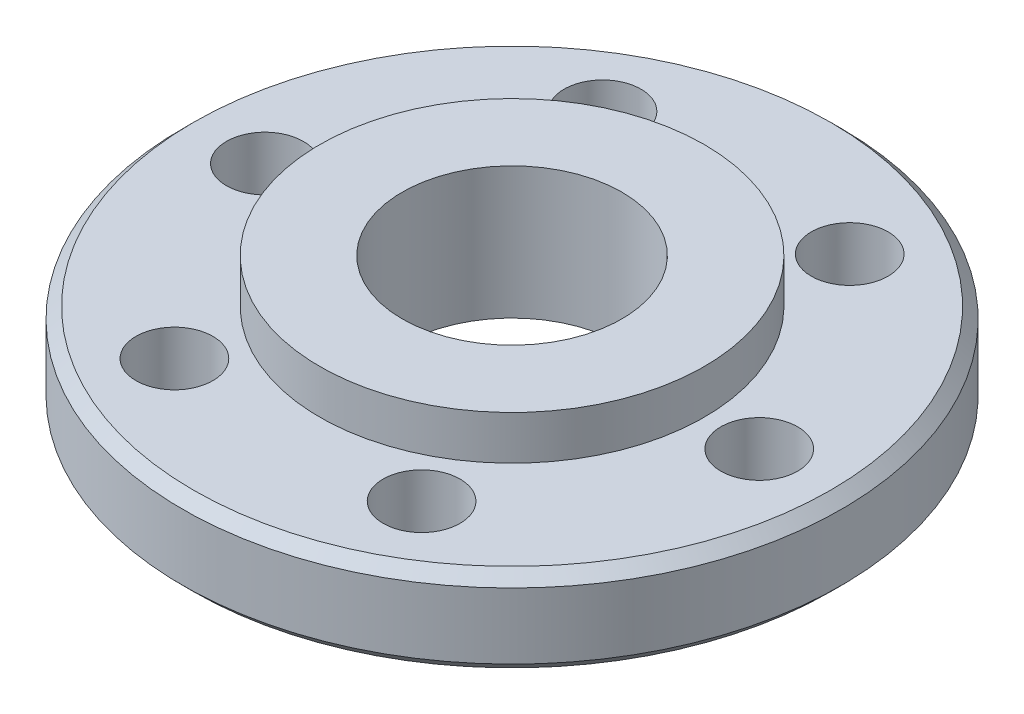
ISO-10303-21;
HEADER;
FILE_DESCRIPTION(('STEP AP214'),'2;1');
FILE_NAME('part.step','',(''),(''),'','','');
FILE_SCHEMA(('AUTOMOTIVE_DESIGN { 1 0 10303 214 1 1 1 1 }'));
ENDSEC;
DATA;
#1=APPLICATION_CONTEXT('core data for automotive mechanical design processes');
#2=APPLICATION_PROTOCOL_DEFINITION('international standard','automotive_design',2000,#1);
#3=PRODUCT_CONTEXT('',#1,'mechanical');
#4=PRODUCT('Part','Part','',(#3));
#5=PRODUCT_RELATED_PRODUCT_CATEGORY('part','',(#4));
#6=PRODUCT_DEFINITION_FORMATION('','',#4);
#7=PRODUCT_DEFINITION_CONTEXT('part definition',#1,'design');
#8=PRODUCT_DEFINITION('design','',#6,#7);
#9=PRODUCT_DEFINITION_SHAPE('','',#8);
#10=(LENGTH_UNIT() NAMED_UNIT(*) SI_UNIT(.MILLI.,.METRE.));
#11=(NAMED_UNIT(*) PLANE_ANGLE_UNIT() SI_UNIT($,.RADIAN.));
#12=(NAMED_UNIT(*) SI_UNIT($,.STERADIAN.) SOLID_ANGLE_UNIT());
#13=UNCERTAINTY_MEASURE_WITH_UNIT(LENGTH_MEASURE(1.E-05),#10,'distance_accuracy_value','');
#14=(GEOMETRIC_REPRESENTATION_CONTEXT(3) GLOBAL_UNCERTAINTY_ASSIGNED_CONTEXT((#13)) GLOBAL_UNIT_ASSIGNED_CONTEXT((#10,
#11,#12)) REPRESENTATION_CONTEXT('',''));
#15=CARTESIAN_POINT('',(0.,0.,0.));
#16=DIRECTION('',(0.,0.,1.));
#17=DIRECTION('',(1.,0.,0.));
#18=AXIS2_PLACEMENT_3D('',#15,#16,#17);
#19=CARTESIAN_POINT('',(0.,-10.,0.));
#20=DIRECTION('',(0.,-1.,0.));
#21=DIRECTION('',(0.,0.,-1.));
#22=AXIS2_PLACEMENT_3D('',#19,#20,#21);
#23=CYLINDRICAL_SURFACE('',#22,20.);
#24=CARTESIAN_POINT('',(0.,0.,0.));
#25=DIRECTION('',(0.,-1.,0.));
#26=DIRECTION('',(0.,0.,-1.));
#27=AXIS2_PLACEMENT_3D('',#24,#25,#26);
#28=CIRCLE('',#27,20.);
#29=CARTESIAN_POINT('',(0.,0.,-20.));
#30=VERTEX_POINT('',#29);
#31=EDGE_CURVE('E10',#30,#30,#28,.T.);
#32=ORIENTED_EDGE('',*,*,#31,.T.);
#33=EDGE_LOOP('',(#32));
#34=FACE_BOUND('',#33,.T.);
#35=CARTESIAN_POINT('',(0.,24.,0.));
#36=DIRECTION('',(0.,-1.,0.));
#37=DIRECTION('',(0.,0.,-1.));
#38=AXIS2_PLACEMENT_3D('',#35,#36,#37);
#39=CIRCLE('',#38,20.);
#40=CARTESIAN_POINT('',(0.,24.,-20.));
#41=VERTEX_POINT('',#40);
#42=EDGE_CURVE('E58',#41,#41,#39,.T.);
#43=ORIENTED_EDGE('',*,*,#42,.F.);
#44=EDGE_LOOP('',(#43));
#45=FACE_BOUND('',#44,.T.);
#46=ADVANCED_FACE('F39',(#34,#45),#23,.F.);
#47=CARTESIAN_POINT('',(20.,0.,0.));
#48=DIRECTION('',(0.,-1.,0.));
#49=DIRECTION('',(0.,0.,-1.));
#50=AXIS2_PLACEMENT_3D('',#47,#48,#49);
#51=PLANE('',#50);
#52=CARTESIAN_POINT('',(22.5000000000005,0.,-38.9711431702995));
#53=DIRECTION('',(0.,1.,0.));
#54=DIRECTION('',(0.866025403784433,0.,0.50000000000001));
#55=AXIS2_PLACEMENT_3D('',#52,#53,#54);
#56=CIRCLE('',#55,7.);
#57=CARTESIAN_POINT('',(28.5621778264915,0.,-35.4711431702994));
#58=VERTEX_POINT('',#57);
#59=EDGE_CURVE('E184',#58,#58,#56,.T.);
#60=ORIENTED_EDGE('',*,*,#59,.T.);
#61=EDGE_LOOP('',(#60));
#62=FACE_BOUND('',#61,.T.);
#63=CARTESIAN_POINT('',(-22.4999999999996,0.,-38.9711431702999));
#64=DIRECTION('',(0.,1.,0.));
#65=DIRECTION('',(0.866025403784443,0.,-0.499999999999992));
#66=AXIS2_PLACEMENT_3D('',#63,#64,#65);
#67=CIRCLE('',#66,7.);
#68=CARTESIAN_POINT('',(-16.4378221735085,0.,-42.4711431702999));
#69=VERTEX_POINT('',#68);
#70=EDGE_CURVE('E180',#69,#69,#67,.T.);
#71=ORIENTED_EDGE('',*,*,#70,.T.);
#72=EDGE_LOOP('',(#71));
#73=FACE_BOUND('',#72,.T.);
#74=CARTESIAN_POINT('',(-45.,0.,0.));
#75=DIRECTION('',(0.,1.,0.));
#76=DIRECTION('',(0.,0.,-1.));
#77=AXIS2_PLACEMENT_3D('',#74,#75,#76);
#78=CIRCLE('',#77,7.);
#79=CARTESIAN_POINT('',(-45.,0.,-7.));
#80=VERTEX_POINT('',#79);
#81=EDGE_CURVE('E176',#80,#80,#78,.T.);
#82=ORIENTED_EDGE('',*,*,#81,.T.);
#83=EDGE_LOOP('',(#82));
#84=FACE_BOUND('',#83,.T.);
#85=CARTESIAN_POINT('',(-22.5000000000002,0.,38.9711431702996));
#86=DIRECTION('',(0.,1.,0.));
#87=DIRECTION('',(-0.866025403784436,0.,-0.500000000000004));
#88=AXIS2_PLACEMENT_3D('',#85,#86,#87);
#89=CIRCLE('',#88,7.);
#90=CARTESIAN_POINT('',(-28.5621778264912,0.,35.4711431702996));
#91=VERTEX_POINT('',#90);
#92=EDGE_CURVE('E174',#91,#91,#89,.T.);
#93=ORIENTED_EDGE('',*,*,#92,.T.);
#94=EDGE_LOOP('',(#93));
#95=FACE_BOUND('',#94,.T.);
#96=CARTESIAN_POINT('',(22.4999999999999,0.,38.9711431702998));
#97=DIRECTION('',(0.,1.,0.));
#98=DIRECTION('',(-0.86602540378444,0.,0.499999999999998));
#99=AXIS2_PLACEMENT_3D('',#96,#97,#98);
#100=CIRCLE('',#99,7.);
#101=CARTESIAN_POINT('',(16.4378221735088,0.,42.4711431702998));
#102=VERTEX_POINT('',#101);
#103=EDGE_CURVE('E64',#102,#102,#100,.T.);
#104=ORIENTED_EDGE('',*,*,#103,.T.);
#105=EDGE_LOOP('',(#104));
#106=FACE_BOUND('',#105,.T.);
#107=CARTESIAN_POINT('',(45.,0.,0.));
#108=DIRECTION('',(0.,1.,0.));
#109=DIRECTION('',(0.,0.,1.));
#110=AXIS2_PLACEMENT_3D('',#107,#108,#109);
#111=CIRCLE('',#110,7.);
#112=CARTESIAN_POINT('',(45.,0.,7.));
#113=VERTEX_POINT('',#112);
#114=EDGE_CURVE('E59',#113,#113,#111,.T.);
#115=ORIENTED_EDGE('',*,*,#114,.T.);
#116=EDGE_LOOP('',(#115));
#117=FACE_BOUND('',#116,.T.);
#118=CARTESIAN_POINT('',(0.,0.,0.));
#119=DIRECTION('',(0.,-1.,0.));
#120=DIRECTION('',(0.,0.,-1.));
#121=AXIS2_PLACEMENT_3D('',#118,#119,#120);
#122=CIRCLE('',#121,58.);
#123=CARTESIAN_POINT('',(0.,0.,-58.));
#124=VERTEX_POINT('',#123);
#125=EDGE_CURVE('E46',#124,#124,#122,.T.);
#126=ORIENTED_EDGE('',*,*,#125,.T.);
#127=EDGE_LOOP('',(#126));
#128=FACE_BOUND('',#127,.T.);
#129=ORIENTED_EDGE('',*,*,#31,.F.);
#130=EDGE_LOOP('',(#129));
#131=FACE_BOUND('',#130,.T.);
#132=ADVANCED_FACE('F114',(#62,#73,#84,#95,#106,#117,#128,#131),#51,.T.);
#133=CARTESIAN_POINT('',(0.,0.,0.));
#134=DIRECTION('',(0.,1.,0.));
#135=DIRECTION('',(0.,0.,1.));
#136=AXIS2_PLACEMENT_3D('',#133,#134,#135);
#137=CONICAL_SURFACE('',#136,58.,0.785398163397447);
#138=CARTESIAN_POINT('',(0.,2.,0.));
#139=DIRECTION('',(0.,-1.,0.));
#140=DIRECTION('',(0.,0.,-1.));
#141=AXIS2_PLACEMENT_3D('',#138,#139,#140);
#142=CIRCLE('',#141,60.);
#143=CARTESIAN_POINT('',(0.,2.,-60.));
#144=VERTEX_POINT('',#143);
#145=EDGE_CURVE('E51',#144,#144,#142,.T.);
#146=ORIENTED_EDGE('',*,*,#145,.T.);
#147=EDGE_LOOP('',(#146));
#148=FACE_BOUND('',#147,.T.);
#149=ORIENTED_EDGE('',*,*,#125,.F.);
#150=EDGE_LOOP('',(#149));
#151=FACE_BOUND('',#150,.T.);
#152=ADVANCED_FACE('F99',(#148,#151),#137,.T.);
#153=CARTESIAN_POINT('',(0.,-10.,0.));
#154=DIRECTION('',(0.,-1.,0.));
#155=DIRECTION('',(0.,0.,-1.));
#156=AXIS2_PLACEMENT_3D('',#153,#154,#155);
#157=CYLINDRICAL_SURFACE('',#156,60.);
#158=CARTESIAN_POINT('',(0.,14.,0.));
#159=DIRECTION('',(0.,-1.,0.));
#160=DIRECTION('',(0.,0.,-1.));
#161=AXIS2_PLACEMENT_3D('',#158,#159,#160);
#162=CIRCLE('',#161,60.);
#163=CARTESIAN_POINT('',(0.,14.,-60.));
#164=VERTEX_POINT('',#163);
#165=EDGE_CURVE('E94',#164,#164,#162,.T.);
#166=ORIENTED_EDGE('',*,*,#165,.T.);
#167=EDGE_LOOP('',(#166));
#168=FACE_BOUND('',#167,.T.);
#169=ORIENTED_EDGE('',*,*,#145,.F.);
#170=EDGE_LOOP('',(#169));
#171=FACE_BOUND('',#170,.T.);
#172=ADVANCED_FACE('F102',(#168,#171),#157,.T.);
#173=CARTESIAN_POINT('',(0.,14.,0.));
#174=DIRECTION('',(0.,-1.,0.));
#175=DIRECTION('',(0.,0.,-1.));
#176=AXIS2_PLACEMENT_3D('',#173,#174,#175);
#177=CONICAL_SURFACE('',#176,60.,0.78539816339745);
#178=CARTESIAN_POINT('',(0.,16.,0.));
#179=DIRECTION('',(0.,-1.,0.));
#180=DIRECTION('',(0.,0.,-1.));
#181=AXIS2_PLACEMENT_3D('',#178,#179,#180);
#182=CIRCLE('',#181,58.);
#183=CARTESIAN_POINT('',(0.,16.,-58.));
#184=VERTEX_POINT('',#183);
#185=EDGE_CURVE('E91',#184,#184,#182,.T.);
#186=ORIENTED_EDGE('',*,*,#185,.T.);
#187=EDGE_LOOP('',(#186));
#188=FACE_BOUND('',#187,.T.);
#189=ORIENTED_EDGE('',*,*,#165,.F.);
#190=EDGE_LOOP('',(#189));
#191=FACE_BOUND('',#190,.T.);
#192=ADVANCED_FACE('F104',(#188,#191),#177,.T.);
#193=CARTESIAN_POINT('',(58.,16.,0.));
#194=DIRECTION('',(0.,1.,0.));
#195=DIRECTION('',(0.,0.,1.));
#196=AXIS2_PLACEMENT_3D('',#193,#194,#195);
#197=PLANE('',#196);
#198=CARTESIAN_POINT('',(22.5000000000005,16.,-38.9711431702995));
#199=DIRECTION('',(0.,1.,0.));
#200=DIRECTION('',(0.,0.,1.));
#201=AXIS2_PLACEMENT_3D('',#198,#199,#200);
#202=CIRCLE('',#201,7.);
#203=CARTESIAN_POINT('',(22.5000000000005,16.,-31.9711431702995));
#204=VERTEX_POINT('',#203);
#205=EDGE_CURVE('E42',#204,#204,#202,.F.);
#206=ORIENTED_EDGE('',*,*,#205,.T.);
#207=EDGE_LOOP('',(#206));
#208=FACE_BOUND('',#207,.T.);
#209=CARTESIAN_POINT('',(-22.4999999999996,16.,-38.9711431702999));
#210=DIRECTION('',(0.,1.,0.));
#211=DIRECTION('',(0.,0.,1.));
#212=AXIS2_PLACEMENT_3D('',#209,#210,#211);
#213=CIRCLE('',#212,7.);
#214=CARTESIAN_POINT('',(-22.4999999999996,16.,-31.9711431702999));
#215=VERTEX_POINT('',#214);
#216=EDGE_CURVE('E69',#215,#215,#213,.F.);
#217=ORIENTED_EDGE('',*,*,#216,.T.);
#218=EDGE_LOOP('',(#217));
#219=FACE_BOUND('',#218,.T.);
#220=CARTESIAN_POINT('',(-45.,16.,0.));
#221=DIRECTION('',(0.,1.,0.));
#222=DIRECTION('',(0.,0.,1.));
#223=AXIS2_PLACEMENT_3D('',#220,#221,#222);
#224=CIRCLE('',#223,7.);
#225=CARTESIAN_POINT('',(-45.,16.,7.));
#226=VERTEX_POINT('',#225);
#227=EDGE_CURVE('E67',#226,#226,#224,.F.);
#228=ORIENTED_EDGE('',*,*,#227,.T.);
#229=EDGE_LOOP('',(#228));
#230=FACE_BOUND('',#229,.T.);
#231=CARTESIAN_POINT('',(-22.5000000000002,16.,38.9711431702996));
#232=DIRECTION('',(0.,1.,0.));
#233=DIRECTION('',(0.,0.,1.));
#234=AXIS2_PLACEMENT_3D('',#231,#232,#233);
#235=CIRCLE('',#234,7.);
#236=CARTESIAN_POINT('',(-22.5000000000002,16.,45.9711431702996));
#237=VERTEX_POINT('',#236);
#238=EDGE_CURVE('E63',#237,#237,#235,.F.);
#239=ORIENTED_EDGE('',*,*,#238,.T.);
#240=EDGE_LOOP('',(#239));
#241=FACE_BOUND('',#240,.T.);
#242=CARTESIAN_POINT('',(22.4999999999999,16.,38.9711431702998));
#243=DIRECTION('',(0.,1.,0.));
#244=DIRECTION('',(0.,0.,1.));
#245=AXIS2_PLACEMENT_3D('',#242,#243,#244);
#246=CIRCLE('',#245,7.);
#247=CARTESIAN_POINT('',(22.4999999999999,16.,45.9711431702998));
#248=VERTEX_POINT('',#247);
#249=EDGE_CURVE('E60',#248,#248,#246,.F.);
#250=ORIENTED_EDGE('',*,*,#249,.T.);
#251=EDGE_LOOP('',(#250));
#252=FACE_BOUND('',#251,.T.);
#253=CARTESIAN_POINT('',(45.,16.,0.));
#254=DIRECTION('',(0.,1.,0.));
#255=DIRECTION('',(0.,0.,1.));
#256=AXIS2_PLACEMENT_3D('',#253,#254,#255);
#257=CIRCLE('',#256,7.);
#258=CARTESIAN_POINT('',(45.,16.,7.));
#259=VERTEX_POINT('',#258);
#260=EDGE_CURVE('E55',#259,#259,#257,.F.);
#261=ORIENTED_EDGE('',*,*,#260,.T.);
#262=EDGE_LOOP('',(#261));
#263=FACE_BOUND('',#262,.T.);
#264=CARTESIAN_POINT('',(0.,16.,0.));
#265=DIRECTION('',(0.,-1.,0.));
#266=DIRECTION('',(0.,0.,-1.));
#267=AXIS2_PLACEMENT_3D('',#264,#265,#266);
#268=CIRCLE('',#267,35.);
#269=CARTESIAN_POINT('',(0.,16.,-35.));
#270=VERTEX_POINT('',#269);
#271=EDGE_CURVE('E88',#270,#270,#268,.T.);
#272=ORIENTED_EDGE('',*,*,#271,.T.);
#273=EDGE_LOOP('',(#272));
#274=FACE_BOUND('',#273,.T.);
#275=ORIENTED_EDGE('',*,*,#185,.F.);
#276=EDGE_LOOP('',(#275));
#277=FACE_BOUND('',#276,.T.);
#278=ADVANCED_FACE('F111',(#208,#219,#230,#241,#252,#263,#274,#277),#197,.T.);
#279=CARTESIAN_POINT('',(0.,-10.,0.));
#280=DIRECTION('',(0.,-1.,0.));
#281=DIRECTION('',(0.,0.,-1.));
#282=AXIS2_PLACEMENT_3D('',#279,#280,#281);
#283=CYLINDRICAL_SURFACE('',#282,35.);
#284=CARTESIAN_POINT('',(0.,24.,0.));
#285=DIRECTION('',(0.,-1.,0.));
#286=DIRECTION('',(0.,0.,-1.));
#287=AXIS2_PLACEMENT_3D('',#284,#285,#286);
#288=CIRCLE('',#287,35.);
#289=CARTESIAN_POINT('',(0.,24.,-35.));
#290=VERTEX_POINT('',#289);
#291=EDGE_CURVE('E85',#290,#290,#288,.T.);
#292=ORIENTED_EDGE('',*,*,#291,.T.);
#293=EDGE_LOOP('',(#292));
#294=FACE_BOUND('',#293,.T.);
#295=ORIENTED_EDGE('',*,*,#271,.F.);
#296=EDGE_LOOP('',(#295));
#297=FACE_BOUND('',#296,.T.);
#298=ADVANCED_FACE('F128',(#294,#297),#283,.T.);
#299=CARTESIAN_POINT('',(35.,24.,0.));
#300=DIRECTION('',(0.,1.,0.));
#301=DIRECTION('',(0.,0.,1.));
#302=AXIS2_PLACEMENT_3D('',#299,#300,#301);
#303=PLANE('',#302);
#304=ORIENTED_EDGE('',*,*,#42,.T.);
#305=EDGE_LOOP('',(#304));
#306=FACE_BOUND('',#305,.T.);
#307=ORIENTED_EDGE('',*,*,#291,.F.);
#308=EDGE_LOOP('',(#307));
#309=FACE_BOUND('',#308,.T.);
#310=ADVANCED_FACE('F124',(#306,#309),#303,.T.);
#311=CARTESIAN_POINT('',(45.,24.,0.));
#312=DIRECTION('',(0.,-1.,0.));
#313=DIRECTION('',(0.,0.,-1.));
#314=AXIS2_PLACEMENT_3D('',#311,#312,#313);
#315=CYLINDRICAL_SURFACE('',#314,7.);
#316=ORIENTED_EDGE('',*,*,#260,.F.);
#317=EDGE_LOOP('',(#316));
#318=FACE_BOUND('',#317,.T.);
#319=ORIENTED_EDGE('',*,*,#114,.F.);
#320=EDGE_LOOP('',(#319));
#321=FACE_BOUND('',#320,.T.);
#322=ADVANCED_FACE('F127',(#318,#321),#315,.F.);
#323=CARTESIAN_POINT('',(22.4999999999999,24.,38.9711431702998));
#324=DIRECTION('',(0.,-1.,0.));
#325=DIRECTION('',(0.,0.,-1.));
#326=AXIS2_PLACEMENT_3D('',#323,#324,#325);
#327=CYLINDRICAL_SURFACE('',#326,7.);
#328=ORIENTED_EDGE('',*,*,#249,.F.);
#329=EDGE_LOOP('',(#328));
#330=FACE_BOUND('',#329,.T.);
#331=ORIENTED_EDGE('',*,*,#103,.F.);
#332=EDGE_LOOP('',(#331));
#333=FACE_BOUND('',#332,.T.);
#334=ADVANCED_FACE('F149',(#330,#333),#327,.F.);
#335=CARTESIAN_POINT('',(-22.5000000000002,24.,38.9711431702996));
#336=DIRECTION('',(0.,-1.,0.));
#337=DIRECTION('',(0.,0.,-1.));
#338=AXIS2_PLACEMENT_3D('',#335,#336,#337);
#339=CYLINDRICAL_SURFACE('',#338,7.);
#340=ORIENTED_EDGE('',*,*,#238,.F.);
#341=EDGE_LOOP('',(#340));
#342=FACE_BOUND('',#341,.T.);
#343=ORIENTED_EDGE('',*,*,#92,.F.);
#344=EDGE_LOOP('',(#343));
#345=FACE_BOUND('',#344,.T.);
#346=ADVANCED_FACE('F152',(#342,#345),#339,.F.);
#347=CARTESIAN_POINT('',(-45.,24.,0.));
#348=DIRECTION('',(0.,-1.,0.));
#349=DIRECTION('',(0.,0.,-1.));
#350=AXIS2_PLACEMENT_3D('',#347,#348,#349);
#351=CYLINDRICAL_SURFACE('',#350,7.);
#352=ORIENTED_EDGE('',*,*,#227,.F.);
#353=EDGE_LOOP('',(#352));
#354=FACE_BOUND('',#353,.T.);
#355=ORIENTED_EDGE('',*,*,#81,.F.);
#356=EDGE_LOOP('',(#355));
#357=FACE_BOUND('',#356,.T.);
#358=ADVANCED_FACE('F161',(#354,#357),#351,.F.);
#359=CARTESIAN_POINT('',(-22.4999999999996,24.,-38.9711431702999));
#360=DIRECTION('',(0.,-1.,0.));
#361=DIRECTION('',(0.,0.,-1.));
#362=AXIS2_PLACEMENT_3D('',#359,#360,#361);
#363=CYLINDRICAL_SURFACE('',#362,7.);
#364=ORIENTED_EDGE('',*,*,#216,.F.);
#365=EDGE_LOOP('',(#364));
#366=FACE_BOUND('',#365,.T.);
#367=ORIENTED_EDGE('',*,*,#70,.F.);
#368=EDGE_LOOP('',(#367));
#369=FACE_BOUND('',#368,.T.);
#370=ADVANCED_FACE('F157',(#366,#369),#363,.F.);
#371=CARTESIAN_POINT('',(22.5000000000005,24.,-38.9711431702995));
#372=DIRECTION('',(0.,-1.,0.));
#373=DIRECTION('',(0.,0.,-1.));
#374=AXIS2_PLACEMENT_3D('',#371,#372,#373);
#375=CYLINDRICAL_SURFACE('',#374,7.);
#376=ORIENTED_EDGE('',*,*,#205,.F.);
#377=EDGE_LOOP('',(#376));
#378=FACE_BOUND('',#377,.T.);
#379=ORIENTED_EDGE('',*,*,#59,.F.);
#380=EDGE_LOOP('',(#379));
#381=FACE_BOUND('',#380,.T.);
#382=ADVANCED_FACE('F154',(#378,#381),#375,.F.);
#383=CLOSED_SHELL('',(#46,#132,#152,#172,#192,#278,#298,#310,#322,#334,#346,#358,#370,#382));
#384=MANIFOLD_SOLID_BREP('B2',#383);
#385=ADVANCED_BREP_SHAPE_REPRESENTATION('',(#18,#384),#14);
#386=SHAPE_DEFINITION_REPRESENTATION(#9,#385);
ENDSEC;
END-ISO-10303-21;
